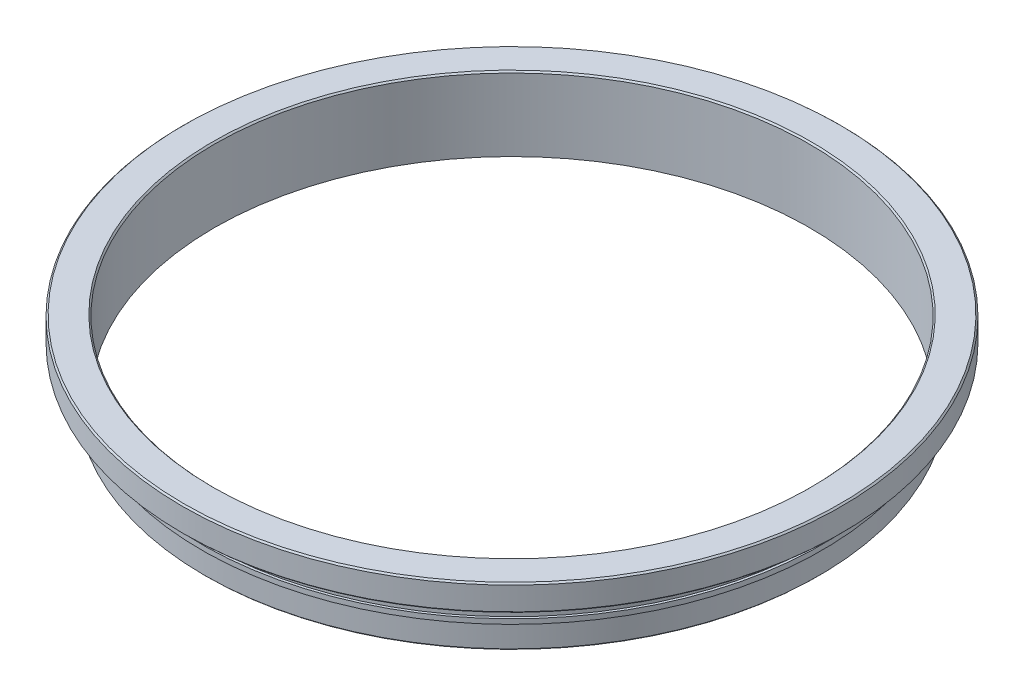
ISO-10303-21;
HEADER;
FILE_DESCRIPTION(('STEP AP214'),'2;1');
FILE_NAME('part.step','',(''),(''),'','','');
FILE_SCHEMA(('AUTOMOTIVE_DESIGN { 1 0 10303 214 1 1 1 1 }'));
ENDSEC;
DATA;
#1=APPLICATION_CONTEXT('core data for automotive mechanical design processes');
#2=APPLICATION_PROTOCOL_DEFINITION('international standard','automotive_design',2000,#1);
#3=PRODUCT_CONTEXT('',#1,'mechanical');
#4=PRODUCT('Part','Part','',(#3));
#5=PRODUCT_RELATED_PRODUCT_CATEGORY('part','',(#4));
#6=PRODUCT_DEFINITION_FORMATION('','',#4);
#7=PRODUCT_DEFINITION_CONTEXT('part definition',#1,'design');
#8=PRODUCT_DEFINITION('design','',#6,#7);
#9=PRODUCT_DEFINITION_SHAPE('','',#8);
#10=(LENGTH_UNIT() NAMED_UNIT(*) SI_UNIT(.MILLI.,.METRE.));
#11=(NAMED_UNIT(*) PLANE_ANGLE_UNIT() SI_UNIT($,.RADIAN.));
#12=(NAMED_UNIT(*) SI_UNIT($,.STERADIAN.) SOLID_ANGLE_UNIT());
#13=UNCERTAINTY_MEASURE_WITH_UNIT(LENGTH_MEASURE(1.E-05),#10,'distance_accuracy_value','');
#14=(GEOMETRIC_REPRESENTATION_CONTEXT(3) GLOBAL_UNCERTAINTY_ASSIGNED_CONTEXT((#13)) GLOBAL_UNIT_ASSIGNED_CONTEXT((#10,
#11,#12)) REPRESENTATION_CONTEXT('',''));
#15=CARTESIAN_POINT('',(0.,0.,0.));
#16=DIRECTION('',(0.,0.,1.));
#17=DIRECTION('',(1.,0.,0.));
#18=AXIS2_PLACEMENT_3D('',#15,#16,#17);
#19=CARTESIAN_POINT('',(0.,15.,0.));
#20=DIRECTION('',(0.,1.,0.));
#21=DIRECTION('',(1.,0.,0.));
#22=AXIS2_PLACEMENT_3D('',#19,#20,#21);
#23=PLANE('',#22);
#24=CARTESIAN_POINT('',(1.399769189447E-12,14.99999920512,-1.51167967033E-12));
#25=DIRECTION('',(0.,1.,0.));
#26=DIRECTION('',(1.,0.,0.));
#27=AXIS2_PLACEMENT_3D('',#24,#25,#26);
#28=CIRCLE('',#27,60.79999562972);
#29=CARTESIAN_POINT('',(1.40721504145061E-12,14.9999992051204,60.7999956297181));
#30=VERTEX_POINT('',#29);
#31=EDGE_CURVE('E146',#30,#30,#28,.T.);
#32=ORIENTED_EDGE('',*,*,#31,.F.);
#33=EDGE_LOOP('',(#32));
#34=FACE_BOUND('',#33,.T.);
#35=CARTESIAN_POINT('',(-7.318590178329E-13,14.99999975328,1.545430450278E-13));
#36=DIRECTION('',(0.,1.,0.));
#37=DIRECTION('',(1.,0.,0.));
#38=AXIS2_PLACEMENT_3D('',#35,#36,#37);
#39=CIRCLE('',#38,66.64999376817);
#40=CARTESIAN_POINT('',(-7.40021287986038E-13,14.9999997532804,66.6499937681705));
#41=VERTEX_POINT('',#40);
#42=EDGE_CURVE('E11',#41,#41,#39,.T.);
#43=ORIENTED_EDGE('',*,*,#42,.T.);
#44=EDGE_LOOP('',(#43));
#45=FACE_BOUND('',#44,.T.);
#46=ADVANCED_FACE('F17',(#34,#45),#23,.T.);
#47=CARTESIAN_POINT('',(-7.318590178329E-13,14.84999646084,1.545430450278E-13));
#48=DIRECTION('',(0.,-1.,0.));
#49=DIRECTION('',(0.,0.,-1.));
#50=AXIS2_PLACEMENT_3D('',#47,#48,#49);
#51=CONICAL_SURFACE('',#50,66.79999704603,0.785398114796137);
#52=CARTESIAN_POINT('',(0.,14.69999393311,0.));
#53=DIRECTION('',(0.,1.,0.));
#54=DIRECTION('',(1.,0.,0.));
#55=AXIS2_PLACEMENT_3D('',#52,#53,#54);
#56=CIRCLE('',#55,66.95);
#57=CARTESIAN_POINT('',(-66.95,14.69999393311,0.));
#58=VERTEX_POINT('',#57);
#59=CARTESIAN_POINT('',(-7.40058028126199E-13,14.6999937126993,66.9499997795902));
#60=VERTEX_POINT('',#59);
#61=EDGE_CURVE('E136',#58,#60,#56,.T.);
#62=ORIENTED_EDGE('',*,*,#61,.T.);
#63=DIRECTION('',(0.,0.707106815552863,-0.70710674682023));
#64=VECTOR('',#63,1.);
#65=CARTESIAN_POINT('',(-7.40039658089447E-13,14.84999646084,66.7999970460302));
#66=LINE('',#65,#64);
#67=EDGE_CURVE('E28',#60,#41,#66,.T.);
#68=ORIENTED_EDGE('',*,*,#67,.T.);
#69=ORIENTED_EDGE('',*,*,#42,.F.);
#70=ORIENTED_EDGE('',*,*,#67,.F.);
#71=CARTESIAN_POINT('',(0.,14.69999393311,0.));
#72=DIRECTION('',(0.,1.,0.));
#73=DIRECTION('',(1.,0.,0.));
#74=AXIS2_PLACEMENT_3D('',#71,#72,#73);
#75=CIRCLE('',#74,66.95);
#76=EDGE_CURVE('E168',#60,#58,#75,.T.);
#77=ORIENTED_EDGE('',*,*,#76,.T.);
#78=EDGE_LOOP('',(#62,#68,#69,#70,#77));
#79=FACE_BOUND('',#78,.T.);
#80=ADVANCED_FACE('F227',(#79),#51,.T.);
#81=CARTESIAN_POINT('',(0.,-0.75,0.));
#82=DIRECTION('',(0.,1.,0.));
#83=DIRECTION('',(1.,0.,0.));
#84=AXIS2_PLACEMENT_3D('',#81,#82,#83);
#85=CYLINDRICAL_SURFACE('',#84,66.95);
#86=ORIENTED_EDGE('',*,*,#61,.F.);
#87=DIRECTION('',(0.,-1.,0.));
#88=VECTOR('',#87,1.);
#89=CARTESIAN_POINT('',(-66.95,-0.75,0.));
#90=LINE('',#89,#88);
#91=CARTESIAN_POINT('',(-66.95,10.00000495009,0.));
#92=VERTEX_POINT('',#91);
#93=EDGE_CURVE('E140',#58,#92,#90,.T.);
#94=ORIENTED_EDGE('',*,*,#93,.T.);
#95=CARTESIAN_POINT('',(0.,10.00000495009,0.));
#96=DIRECTION('',(0.,1.,0.));
#97=DIRECTION('',(1.,0.,0.));
#98=AXIS2_PLACEMENT_3D('',#95,#96,#97);
#99=CIRCLE('',#98,66.95);
#100=CARTESIAN_POINT('',(-1.55499500836644E-12,10.0000050703822,66.9499998797095));
#101=VERTEX_POINT('',#100);
#102=EDGE_CURVE('E164',#92,#101,#99,.T.);
#103=ORIENTED_EDGE('',*,*,#102,.T.);
#104=CARTESIAN_POINT('',(0.,10.00000495009,0.));
#105=DIRECTION('',(0.,1.,0.));
#106=DIRECTION('',(1.,0.,0.));
#107=AXIS2_PLACEMENT_3D('',#104,#105,#106);
#108=CIRCLE('',#107,66.95);
#109=EDGE_CURVE('E150',#101,#92,#108,.T.);
#110=ORIENTED_EDGE('',*,*,#109,.T.);
#111=ORIENTED_EDGE('',*,*,#93,.F.);
#112=ORIENTED_EDGE('',*,*,#76,.F.);
#113=EDGE_LOOP('',(#86,#94,#103,#110,#111,#112));
#114=FACE_BOUND('',#113,.T.);
#115=ADVANCED_FACE('F205',(#114),#85,.T.);
#116=CARTESIAN_POINT('',(-1.563194018672E-12,9.850002810763,0.));
#117=DIRECTION('',(0.,1.,0.));
#118=DIRECTION('',(0.,0.,-1.));
#119=AXIS2_PLACEMENT_3D('',#116,#117,#118);
#120=CONICAL_SURFACE('',#119,66.79999763172,0.785398124632115);
#121=ORIENTED_EDGE('',*,*,#102,.F.);
#122=ORIENTED_EDGE('',*,*,#109,.F.);
#123=DIRECTION('',(0.,-0.707106808597777,-0.707106753775317));
#124=VECTOR('',#123,1.);
#125=CARTESIAN_POINT('',(-1.55501337834373E-12,9.850002810763,66.7999976317201));
#126=LINE('',#125,#124);
#127=CARTESIAN_POINT('',(-1.55503174837111E-12,9.70000014210309,66.64999497469));
#128=VERTEX_POINT('',#127);
#129=EDGE_CURVE('E141',#101,#128,#126,.T.);
#130=ORIENTED_EDGE('',*,*,#129,.T.);
#131=CARTESIAN_POINT('',(-1.563194018672E-12,9.700000142103,0.));
#132=DIRECTION('',(0.,1.,0.));
#133=DIRECTION('',(1.,0.,0.));
#134=AXIS2_PLACEMENT_3D('',#131,#132,#133);
#135=CIRCLE('',#134,66.64999497469);
#136=EDGE_CURVE('E160',#128,#128,#135,.T.);
#137=ORIENTED_EDGE('',*,*,#136,.T.);
#138=ORIENTED_EDGE('',*,*,#129,.F.);
#139=EDGE_LOOP('',(#121,#122,#130,#137,#138));
#140=FACE_BOUND('',#139,.T.);
#141=ADVANCED_FACE('F208',(#140),#120,.T.);
#142=CARTESIAN_POINT('',(0.,9.7,0.));
#143=DIRECTION('',(0.,1.,0.));
#144=DIRECTION('',(1.,0.,0.));
#145=AXIS2_PLACEMENT_3D('',#142,#143,#144);
#146=PLANE('',#145);
#147=CARTESIAN_POINT('',(0.,9.7,0.));
#148=DIRECTION('',(0.,-1.,0.));
#149=DIRECTION('',(1.,0.,0.));
#150=AXIS2_PLACEMENT_3D('',#147,#148,#149);
#151=CIRCLE('',#150,63.);
#152=CARTESIAN_POINT('',(-63.,9.7,0.));
#153=VERTEX_POINT('',#152);
#154=EDGE_CURVE('E130',#153,#153,#151,.T.);
#155=ORIENTED_EDGE('',*,*,#154,.F.);
#156=EDGE_LOOP('',(#155));
#157=FACE_BOUND('',#156,.T.);
#158=ORIENTED_EDGE('',*,*,#136,.F.);
#159=EDGE_LOOP('',(#158));
#160=FACE_BOUND('',#159,.T.);
#161=ADVANCED_FACE('F211',(#157,#160),#146,.F.);
#162=CARTESIAN_POINT('',(0.,-0.75,0.));
#163=DIRECTION('',(0.,1.,0.));
#164=DIRECTION('',(1.,0.,0.));
#165=AXIS2_PLACEMENT_3D('',#162,#163,#164);
#166=CYLINDRICAL_SURFACE('',#165,63.);
#167=ORIENTED_EDGE('',*,*,#154,.T.);
#168=DIRECTION('',(0.,-1.,0.));
#169=VECTOR('',#168,1.);
#170=CARTESIAN_POINT('',(-63.,-0.75,0.));
#171=LINE('',#170,#169);
#172=CARTESIAN_POINT('',(-63.,7.5,0.));
#173=VERTEX_POINT('',#172);
#174=EDGE_CURVE('E110',#153,#173,#171,.T.);
#175=ORIENTED_EDGE('',*,*,#174,.T.);
#176=CARTESIAN_POINT('',(0.,7.5,0.));
#177=DIRECTION('',(0.,-1.,0.));
#178=DIRECTION('',(1.,0.,0.));
#179=AXIS2_PLACEMENT_3D('',#176,#177,#178);
#180=CIRCLE('',#179,63.);
#181=EDGE_CURVE('E123',#173,#173,#180,.T.);
#182=ORIENTED_EDGE('',*,*,#181,.F.);
#183=ORIENTED_EDGE('',*,*,#174,.F.);
#184=EDGE_LOOP('',(#167,#175,#182,#183));
#185=FACE_BOUND('',#184,.T.);
#186=ADVANCED_FACE('F213',(#185),#166,.T.);
#187=CARTESIAN_POINT('',(0.,7.5,0.));
#188=DIRECTION('',(0.,1.,0.));
#189=DIRECTION('',(1.,0.,0.));
#190=AXIS2_PLACEMENT_3D('',#187,#188,#189);
#191=PLANE('',#190);
#192=CARTESIAN_POINT('',(0.,7.5,0.));
#193=DIRECTION('',(0.,-1.,0.));
#194=DIRECTION('',(1.,0.,0.));
#195=AXIS2_PLACEMENT_3D('',#192,#193,#194);
#196=CIRCLE('',#195,62.5);
#197=CARTESIAN_POINT('',(-62.5,7.5,0.));
#198=VERTEX_POINT('',#197);
#199=EDGE_CURVE('E21',#198,#198,#196,.T.);
#200=ORIENTED_EDGE('',*,*,#199,.F.);
#201=EDGE_LOOP('',(#200));
#202=FACE_BOUND('',#201,.T.);
#203=ORIENTED_EDGE('',*,*,#181,.T.);
#204=EDGE_LOOP('',(#203));
#205=FACE_BOUND('',#204,.T.);
#206=ADVANCED_FACE('F221',(#202,#205),#191,.F.);
#207=CARTESIAN_POINT('',(0.,-0.75,0.));
#208=DIRECTION('',(0.,1.,0.));
#209=DIRECTION('',(1.,0.,0.));
#210=AXIS2_PLACEMENT_3D('',#207,#208,#209);
#211=CYLINDRICAL_SURFACE('',#210,62.5);
#212=ORIENTED_EDGE('',*,*,#199,.T.);
#213=DIRECTION('',(0.,-1.,0.));
#214=VECTOR('',#213,1.);
#215=CARTESIAN_POINT('',(-62.5,-0.75,0.));
#216=LINE('',#215,#214);
#217=CARTESIAN_POINT('',(-62.5,6.,0.));
#218=VERTEX_POINT('',#217);
#219=EDGE_CURVE('E118',#198,#218,#216,.T.);
#220=ORIENTED_EDGE('',*,*,#219,.T.);
#221=CARTESIAN_POINT('',(0.,6.,0.));
#222=DIRECTION('',(0.,-1.,0.));
#223=DIRECTION('',(1.,0.,0.));
#224=AXIS2_PLACEMENT_3D('',#221,#222,#223);
#225=CIRCLE('',#224,62.5);
#226=EDGE_CURVE('E121',#218,#218,#225,.T.);
#227=ORIENTED_EDGE('',*,*,#226,.F.);
#228=ORIENTED_EDGE('',*,*,#219,.F.);
#229=EDGE_LOOP('',(#212,#220,#227,#228));
#230=FACE_BOUND('',#229,.T.);
#231=ADVANCED_FACE('F19',(#230),#211,.T.);
#232=CARTESIAN_POINT('',(0.,6.,0.));
#233=DIRECTION('',(0.,1.,0.));
#234=DIRECTION('',(1.,0.,0.));
#235=AXIS2_PLACEMENT_3D('',#232,#233,#234);
#236=PLANE('',#235);
#237=ORIENTED_EDGE('',*,*,#226,.T.);
#238=EDGE_LOOP('',(#237));
#239=FACE_BOUND('',#238,.T.);
#240=CARTESIAN_POINT('',(0.,6.,0.));
#241=DIRECTION('',(0.,-1.,0.));
#242=DIRECTION('',(1.,0.,0.));
#243=AXIS2_PLACEMENT_3D('',#240,#241,#242);
#244=CIRCLE('',#243,63.);
#245=CARTESIAN_POINT('',(-63.,6.,0.));
#246=VERTEX_POINT('',#245);
#247=EDGE_CURVE('E153',#246,#246,#244,.T.);
#248=ORIENTED_EDGE('',*,*,#247,.F.);
#249=EDGE_LOOP('',(#248));
#250=FACE_BOUND('',#249,.T.);
#251=ADVANCED_FACE('F303',(#239,#250),#236,.T.);
#252=CARTESIAN_POINT('',(0.,-0.75,0.));
#253=DIRECTION('',(0.,1.,0.));
#254=DIRECTION('',(1.,0.,0.));
#255=AXIS2_PLACEMENT_3D('',#252,#253,#254);
#256=CYLINDRICAL_SURFACE('',#255,63.);
#257=ORIENTED_EDGE('',*,*,#247,.T.);
#258=DIRECTION('',(0.,-1.,0.));
#259=VECTOR('',#258,1.);
#260=CARTESIAN_POINT('',(-63.,-0.75,0.));
#261=LINE('',#260,#259);
#262=CARTESIAN_POINT('',(-63.,5.,0.));
#263=VERTEX_POINT('',#262);
#264=EDGE_CURVE('E90',#246,#263,#261,.T.);
#265=ORIENTED_EDGE('',*,*,#264,.T.);
#266=CARTESIAN_POINT('',(0.,5.,0.));
#267=DIRECTION('',(0.,-1.,0.));
#268=DIRECTION('',(1.,0.,0.));
#269=AXIS2_PLACEMENT_3D('',#266,#267,#268);
#270=CIRCLE('',#269,63.);
#271=EDGE_CURVE('E133',#263,#263,#270,.T.);
#272=ORIENTED_EDGE('',*,*,#271,.F.);
#273=ORIENTED_EDGE('',*,*,#264,.F.);
#274=EDGE_LOOP('',(#257,#265,#272,#273));
#275=FACE_BOUND('',#274,.T.);
#276=ADVANCED_FACE('F239',(#275),#256,.T.);
#277=CARTESIAN_POINT('',(0.,5.,0.));
#278=DIRECTION('',(0.,1.,0.));
#279=DIRECTION('',(1.,0.,0.));
#280=AXIS2_PLACEMENT_3D('',#277,#278,#279);
#281=PLANE('',#280);
#282=CARTESIAN_POINT('',(0.,5.,0.));
#283=DIRECTION('',(0.,1.,0.));
#284=DIRECTION('',(1.,0.,0.));
#285=AXIS2_PLACEMENT_3D('',#282,#283,#284);
#286=CIRCLE('',#285,62.45);
#287=CARTESIAN_POINT('',(-62.45,5.,0.));
#288=VERTEX_POINT('',#287);
#289=EDGE_CURVE('E287',#288,#288,#286,.T.);
#290=ORIENTED_EDGE('',*,*,#289,.T.);
#291=EDGE_LOOP('',(#290));
#292=FACE_BOUND('',#291,.T.);
#293=ORIENTED_EDGE('',*,*,#271,.T.);
#294=EDGE_LOOP('',(#293));
#295=FACE_BOUND('',#294,.T.);
#296=ADVANCED_FACE('F236',(#292,#295),#281,.F.);
#297=CARTESIAN_POINT('',(0.,-0.75,0.));
#298=DIRECTION('',(0.,1.,0.));
#299=DIRECTION('',(1.,0.,0.));
#300=AXIS2_PLACEMENT_3D('',#297,#298,#299);
#301=CYLINDRICAL_SURFACE('',#300,62.45);
#302=ORIENTED_EDGE('',*,*,#289,.F.);
#303=DIRECTION('',(0.,-1.,0.));
#304=VECTOR('',#303,1.);
#305=CARTESIAN_POINT('',(-62.45,-0.75,0.));
#306=LINE('',#305,#304);
#307=CARTESIAN_POINT('',(-62.45,0.3000049627516,0.));
#308=VERTEX_POINT('',#307);
#309=EDGE_CURVE('E265',#288,#308,#306,.T.);
#310=ORIENTED_EDGE('',*,*,#309,.T.);
#311=CARTESIAN_POINT('',(0.,0.3000049627516,0.));
#312=DIRECTION('',(0.,1.,0.));
#313=DIRECTION('',(1.,0.,0.));
#314=AXIS2_PLACEMENT_3D('',#311,#312,#313);
#315=CIRCLE('',#314,62.45);
#316=CARTESIAN_POINT('',(-1.62882337344881E-13,0.300005151839769,62.4499998109127));
#317=VERTEX_POINT('',#316);
#318=EDGE_CURVE('E171',#308,#317,#315,.T.);
#319=ORIENTED_EDGE('',*,*,#318,.T.);
#320=CARTESIAN_POINT('',(0.,0.3000049627516,0.));
#321=DIRECTION('',(0.,1.,0.));
#322=DIRECTION('',(1.,0.,0.));
#323=AXIS2_PLACEMENT_3D('',#320,#321,#322);
#324=CIRCLE('',#323,62.45);
#325=EDGE_CURVE('E175',#317,#308,#324,.T.);
#326=ORIENTED_EDGE('',*,*,#325,.T.);
#327=ORIENTED_EDGE('',*,*,#309,.F.);
#328=EDGE_LOOP('',(#302,#310,#319,#326,#327));
#329=FACE_BOUND('',#328,.T.);
#330=ADVANCED_FACE('F238',(#329),#301,.T.);
#331=CARTESIAN_POINT('',(-1.705302565824E-13,0.1500028890188,3.694822225953E-13));
#332=DIRECTION('',(0.,1.,0.));
#333=DIRECTION('',(0.,0.,-1.));
#334=AXIS2_PLACEMENT_3D('',#331,#332,#333);
#335=CONICAL_SURFACE('',#334,62.29999756092,0.785398120635835);
#336=ORIENTED_EDGE('',*,*,#318,.F.);
#337=ORIENTED_EDGE('',*,*,#325,.F.);
#338=DIRECTION('',(0.,-0.707106811423574,-0.70710675094952));
#339=VECTOR('',#338,1.);
#340=CARTESIAN_POINT('',(-1.62900707322413E-13,0.1500028890188,62.2999975609204));
#341=LINE('',#340,#339);
#342=CARTESIAN_POINT('',(-1.62919077350848E-13,2.10541061147762E-07,62.1499948952713));
#343=VERTEX_POINT('',#342);
#344=EDGE_CURVE('E190',#317,#343,#341,.T.);
#345=ORIENTED_EDGE('',*,*,#344,.T.);
#346=CARTESIAN_POINT('',(-1.705302565824E-13,2.105420406906E-07,3.694822225953E-13));
#347=DIRECTION('',(0.,1.,0.));
#348=DIRECTION('',(1.,0.,0.));
#349=AXIS2_PLACEMENT_3D('',#346,#347,#348);
#350=CIRCLE('',#349,62.14999489527);
#351=EDGE_CURVE('E176',#343,#343,#350,.T.);
#352=ORIENTED_EDGE('',*,*,#351,.T.);
#353=ORIENTED_EDGE('',*,*,#344,.F.);
#354=EDGE_LOOP('',(#336,#337,#345,#352,#353));
#355=FACE_BOUND('',#354,.T.);
#356=ADVANCED_FACE('F247',(#355),#335,.T.);
#357=CARTESIAN_POINT('',(0.,0.,0.));
#358=DIRECTION('',(0.,1.,0.));
#359=DIRECTION('',(1.,0.,0.));
#360=AXIS2_PLACEMENT_3D('',#357,#358,#359);
#361=PLANE('',#360);
#362=CARTESIAN_POINT('',(0.,0.,0.));
#363=DIRECTION('',(0.,1.,0.));
#364=DIRECTION('',(1.,0.,0.));
#365=AXIS2_PLACEMENT_3D('',#362,#363,#364);
#366=CIRCLE('',#365,60.5);
#367=CARTESIAN_POINT('',(-60.5,0.,0.));
#368=VERTEX_POINT('',#367);
#369=EDGE_CURVE('E159',#368,#368,#366,.T.);
#370=ORIENTED_EDGE('',*,*,#369,.T.);
#371=EDGE_LOOP('',(#370));
#372=FACE_BOUND('',#371,.T.);
#373=ORIENTED_EDGE('',*,*,#351,.F.);
#374=EDGE_LOOP('',(#373));
#375=FACE_BOUND('',#374,.T.);
#376=ADVANCED_FACE('F249',(#372,#375),#361,.F.);
#377=CARTESIAN_POINT('',(1.399769189447E-12,14.85000176781,-1.51167967033E-12));
#378=DIRECTION('',(0.,1.,0.));
#379=DIRECTION('',(0.,0.,-1.));
#380=AXIS2_PLACEMENT_3D('',#377,#378,#379);
#381=CONICAL_SURFACE('',#380,60.64999820123,0.78539813399441);
#382=CARTESIAN_POINT('',(0.,14.70000518661,0.));
#383=DIRECTION('',(0.,1.,0.));
#384=DIRECTION('',(1.,0.,0.));
#385=AXIS2_PLACEMENT_3D('',#382,#383,#384);
#386=CIRCLE('',#385,60.5);
#387=CARTESIAN_POINT('',(1.40717830268158E-12,14.7000043721836,60.5000008144229));
#388=VERTEX_POINT('',#387);
#389=CARTESIAN_POINT('',(-60.5,14.70000518661,0.));
#390=VERTEX_POINT('',#389);
#391=EDGE_CURVE('E147',#388,#390,#386,.T.);
#392=ORIENTED_EDGE('',*,*,#391,.F.);
#393=DIRECTION('',(0.,0.707106801977635,0.707106760395459));
#394=VECTOR('',#393,1.);
#395=CARTESIAN_POINT('',(1.40719667206354E-12,14.85000176781,60.6499982012285));
#396=LINE('',#395,#394);
#397=EDGE_CURVE('E142',#388,#30,#396,.T.);
#398=ORIENTED_EDGE('',*,*,#397,.T.);
#399=ORIENTED_EDGE('',*,*,#31,.T.);
#400=ORIENTED_EDGE('',*,*,#397,.F.);
#401=CARTESIAN_POINT('',(0.,14.70000518661,0.));
#402=DIRECTION('',(0.,1.,0.));
#403=DIRECTION('',(1.,0.,0.));
#404=AXIS2_PLACEMENT_3D('',#401,#402,#403);
#405=CIRCLE('',#404,60.5);
#406=EDGE_CURVE('E158',#390,#388,#405,.T.);
#407=ORIENTED_EDGE('',*,*,#406,.F.);
#408=EDGE_LOOP('',(#392,#398,#399,#400,#407));
#409=FACE_BOUND('',#408,.T.);
#410=ADVANCED_FACE('F252',(#409),#381,.F.);
#411=CARTESIAN_POINT('',(0.,-0.75,0.));
#412=DIRECTION('',(0.,1.,0.));
#413=DIRECTION('',(1.,0.,0.));
#414=AXIS2_PLACEMENT_3D('',#411,#412,#413);
#415=CYLINDRICAL_SURFACE('',#414,60.5);
#416=ORIENTED_EDGE('',*,*,#369,.F.);
#417=DIRECTION('',(0.,1.,0.));
#418=VECTOR('',#417,1.);
#419=CARTESIAN_POINT('',(-60.5,-0.75,0.));
#420=LINE('',#419,#418);
#421=EDGE_CURVE('E154',#368,#390,#420,.T.);
#422=ORIENTED_EDGE('',*,*,#421,.T.);
#423=ORIENTED_EDGE('',*,*,#406,.T.);
#424=ORIENTED_EDGE('',*,*,#391,.T.);
#425=ORIENTED_EDGE('',*,*,#421,.F.);
#426=EDGE_LOOP('',(#416,#422,#423,#424,#425));
#427=FACE_BOUND('',#426,.T.);
#428=ADVANCED_FACE('F311',(#427),#415,.F.);
#429=CLOSED_SHELL('',(#46,#80,#115,#141,#161,#186,#206,#231,#251,#276,#296,#330,#356,#376,#410,#428));
#430=MANIFOLD_SOLID_BREP('B1',#429);
#431=ADVANCED_BREP_SHAPE_REPRESENTATION('',(#18,#430),#14);
#432=SHAPE_DEFINITION_REPRESENTATION(#9,#431);
ENDSEC;
END-ISO-10303-21;
